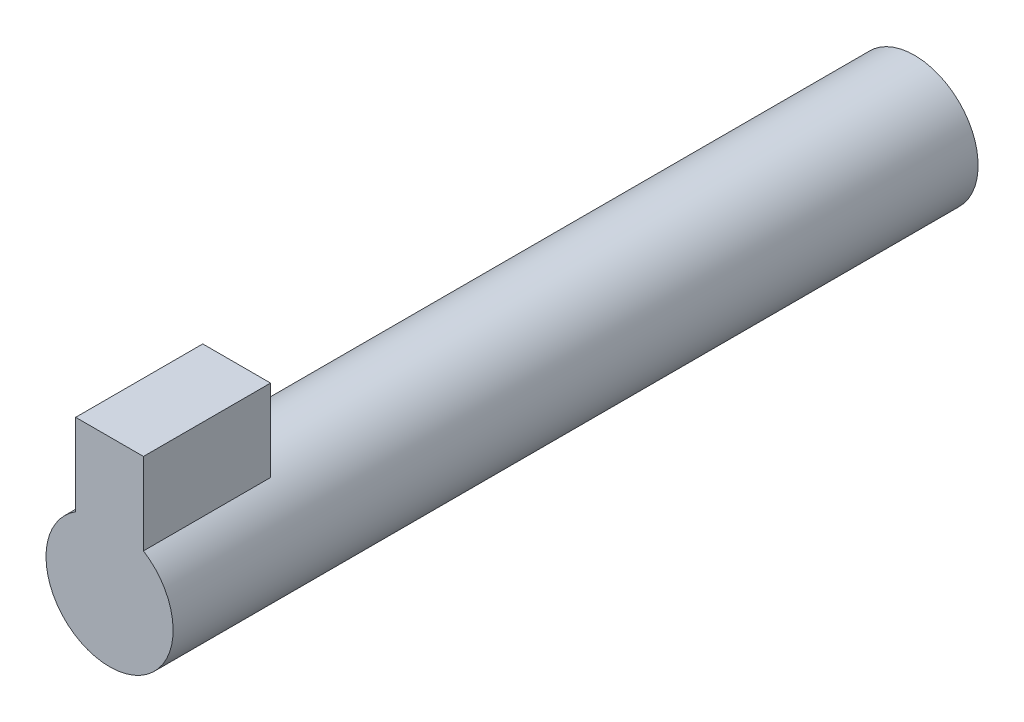
ISO-10303-21;
HEADER;
FILE_DESCRIPTION(('STEP AP214'),'2;1');
FILE_NAME('part.step','',(''),(''),'','','');
FILE_SCHEMA(('AUTOMOTIVE_DESIGN { 1 0 10303 214 1 1 1 1 }'));
ENDSEC;
DATA;
#1=APPLICATION_CONTEXT('core data for automotive mechanical design processes');
#2=APPLICATION_PROTOCOL_DEFINITION('international standard','automotive_design',2000,#1);
#3=PRODUCT_CONTEXT('',#1,'mechanical');
#4=PRODUCT('Part','Part','',(#3));
#5=PRODUCT_RELATED_PRODUCT_CATEGORY('part','',(#4));
#6=PRODUCT_DEFINITION_FORMATION('','',#4);
#7=PRODUCT_DEFINITION_CONTEXT('part definition',#1,'design');
#8=PRODUCT_DEFINITION('design','',#6,#7);
#9=PRODUCT_DEFINITION_SHAPE('','',#8);
#10=(LENGTH_UNIT() NAMED_UNIT(*) SI_UNIT(.MILLI.,.METRE.));
#11=(NAMED_UNIT(*) PLANE_ANGLE_UNIT() SI_UNIT($,.RADIAN.));
#12=(NAMED_UNIT(*) SI_UNIT($,.STERADIAN.) SOLID_ANGLE_UNIT());
#13=UNCERTAINTY_MEASURE_WITH_UNIT(LENGTH_MEASURE(1.E-05),#10,'distance_accuracy_value','');
#14=(GEOMETRIC_REPRESENTATION_CONTEXT(3) GLOBAL_UNCERTAINTY_ASSIGNED_CONTEXT((#13)) GLOBAL_UNIT_ASSIGNED_CONTEXT((#10,
#11,#12)) REPRESENTATION_CONTEXT('',''));
#15=CARTESIAN_POINT('',(0.,0.,0.));
#16=DIRECTION('',(0.,0.,1.));
#17=DIRECTION('',(1.,0.,0.));
#18=AXIS2_PLACEMENT_3D('',#15,#16,#17);
#19=CARTESIAN_POINT('',(0.,0.,0.));
#20=DIRECTION('',(0.,0.,1.));
#21=DIRECTION('',(1.,0.,0.));
#22=AXIS2_PLACEMENT_3D('',#19,#20,#21);
#23=PLANE('',#22);
#24=CARTESIAN_POINT('',(0.,0.,0.));
#25=DIRECTION('',(0.,0.,-1.));
#26=DIRECTION('',(-1.,0.,0.));
#27=AXIS2_PLACEMENT_3D('',#24,#25,#26);
#28=CIRCLE('',#27,4.7625);
#29=CARTESIAN_POINT('',(-2.54,4.02862336909272,0.));
#30=VERTEX_POINT('',#29);
#31=CARTESIAN_POINT('',(2.54,4.02862336909272,0.));
#32=VERTEX_POINT('',#31);
#33=EDGE_CURVE('E96',#30,#32,#28,.T.);
#34=ORIENTED_EDGE('',*,*,#33,.F.);
#35=DIRECTION('',(0.,1.,0.));
#36=VECTOR('',#35,1.);
#37=CARTESIAN_POINT('',(-2.54,0.,0.));
#38=LINE('',#37,#36);
#39=CARTESIAN_POINT('',(-2.54,10.16,0.));
#40=VERTEX_POINT('',#39);
#41=EDGE_CURVE('E98',#30,#40,#38,.T.);
#42=ORIENTED_EDGE('',*,*,#41,.T.);
#43=DIRECTION('',(1.,0.,0.));
#44=VECTOR('',#43,1.);
#45=CARTESIAN_POINT('',(0.,10.16,0.));
#46=LINE('',#45,#44);
#47=CARTESIAN_POINT('',(2.54,10.16,0.));
#48=VERTEX_POINT('',#47);
#49=EDGE_CURVE('E113',#40,#48,#46,.T.);
#50=ORIENTED_EDGE('',*,*,#49,.T.);
#51=DIRECTION('',(0.,1.,0.));
#52=VECTOR('',#51,1.);
#53=CARTESIAN_POINT('',(2.54,0.,0.));
#54=LINE('',#53,#52);
#55=EDGE_CURVE('E99',#32,#48,#54,.T.);
#56=ORIENTED_EDGE('',*,*,#55,.F.);
#57=EDGE_LOOP('',(#34,#42,#50,#56));
#58=FACE_BOUND('',#57,.T.);
#59=ADVANCED_FACE('F47',(#58),#23,.F.);
#60=CARTESIAN_POINT('',(0.,0.,9.525));
#61=DIRECTION('',(0.,0.,-1.));
#62=DIRECTION('',(-1.,0.,0.));
#63=AXIS2_PLACEMENT_3D('',#60,#61,#62);
#64=CYLINDRICAL_SURFACE('',#63,4.7625);
#65=DIRECTION('',(0.,0.,-1.));
#66=VECTOR('',#65,1.);
#67=CARTESIAN_POINT('',(-2.54,4.02862336909272,9.525));
#68=LINE('',#67,#66);
#69=CARTESIAN_POINT('',(-2.54,4.02862336909272,9.525));
#70=VERTEX_POINT('',#69);
#71=EDGE_CURVE('E65',#70,#30,#68,.T.);
#72=ORIENTED_EDGE('',*,*,#71,.T.);
#73=ORIENTED_EDGE('',*,*,#33,.T.);
#74=DIRECTION('',(0.,0.,-1.));
#75=VECTOR('',#74,1.);
#76=CARTESIAN_POINT('',(2.54,4.02862336909272,9.525));
#77=LINE('',#76,#75);
#78=CARTESIAN_POINT('',(2.54,4.02862336909272,9.525));
#79=VERTEX_POINT('',#78);
#80=EDGE_CURVE('E11',#79,#32,#77,.T.);
#81=ORIENTED_EDGE('',*,*,#80,.F.);
#82=CARTESIAN_POINT('',(0.,0.,9.525));
#83=DIRECTION('',(0.,0.,1.));
#84=DIRECTION('',(1.,0.,0.));
#85=AXIS2_PLACEMENT_3D('',#82,#83,#84);
#86=CIRCLE('',#85,4.7625);
#87=EDGE_CURVE('E106',#70,#79,#86,.T.);
#88=ORIENTED_EDGE('',*,*,#87,.F.);
#89=EDGE_LOOP('',(#72,#73,#81,#88));
#90=FACE_BOUND('',#89,.T.);
#91=CARTESIAN_POINT('',(0.,0.,-50.8));
#92=DIRECTION('',(0.,0.,-1.));
#93=DIRECTION('',(-1.,0.,0.));
#94=AXIS2_PLACEMENT_3D('',#91,#92,#93);
#95=CIRCLE('',#94,4.7625);
#96=CARTESIAN_POINT('',(-4.7625,0.,-50.8));
#97=VERTEX_POINT('',#96);
#98=EDGE_CURVE('E103',#97,#97,#95,.T.);
#99=ORIENTED_EDGE('',*,*,#98,.F.);
#100=EDGE_LOOP('',(#99));
#101=FACE_BOUND('',#100,.T.);
#102=ADVANCED_FACE('F49',(#90,#101),#64,.T.);
#103=CARTESIAN_POINT('',(2.54,0.,9.525));
#104=DIRECTION('',(-1.,0.,0.));
#105=DIRECTION('',(0.,-1.,0.));
#106=AXIS2_PLACEMENT_3D('',#103,#104,#105);
#107=PLANE('',#106);
#108=ORIENTED_EDGE('',*,*,#55,.T.);
#109=DIRECTION('',(0.,0.,-1.));
#110=VECTOR('',#109,1.);
#111=CARTESIAN_POINT('',(2.54,10.16,9.525));
#112=LINE('',#111,#110);
#113=CARTESIAN_POINT('',(2.54,10.16,9.525));
#114=VERTEX_POINT('',#113);
#115=EDGE_CURVE('E57',#114,#48,#112,.T.);
#116=ORIENTED_EDGE('',*,*,#115,.F.);
#117=DIRECTION('',(0.,1.,0.));
#118=VECTOR('',#117,1.);
#119=CARTESIAN_POINT('',(2.54,0.,9.525));
#120=LINE('',#119,#118);
#121=EDGE_CURVE('E89',#79,#114,#120,.T.);
#122=ORIENTED_EDGE('',*,*,#121,.F.);
#123=ORIENTED_EDGE('',*,*,#80,.T.);
#124=EDGE_LOOP('',(#108,#116,#122,#123));
#125=FACE_BOUND('',#124,.T.);
#126=ADVANCED_FACE('F140',(#125),#107,.F.);
#127=CARTESIAN_POINT('',(0.,10.16,9.525));
#128=DIRECTION('',(0.,1.,0.));
#129=DIRECTION('',(-1.,0.,0.));
#130=AXIS2_PLACEMENT_3D('',#127,#128,#129);
#131=PLANE('',#130);
#132=ORIENTED_EDGE('',*,*,#49,.F.);
#133=DIRECTION('',(0.,0.,-1.));
#134=VECTOR('',#133,1.);
#135=CARTESIAN_POINT('',(-2.54,10.16,9.525));
#136=LINE('',#135,#134);
#137=CARTESIAN_POINT('',(-2.54,10.16,9.525));
#138=VERTEX_POINT('',#137);
#139=EDGE_CURVE('E84',#138,#40,#136,.T.);
#140=ORIENTED_EDGE('',*,*,#139,.F.);
#141=DIRECTION('',(1.,0.,0.));
#142=VECTOR('',#141,1.);
#143=CARTESIAN_POINT('',(0.,10.16,9.525));
#144=LINE('',#143,#142);
#145=EDGE_CURVE('E125',#138,#114,#144,.T.);
#146=ORIENTED_EDGE('',*,*,#145,.T.);
#147=ORIENTED_EDGE('',*,*,#115,.T.);
#148=EDGE_LOOP('',(#132,#140,#146,#147));
#149=FACE_BOUND('',#148,.T.);
#150=ADVANCED_FACE('F145',(#149),#131,.T.);
#151=CARTESIAN_POINT('',(-2.54,0.,9.525));
#152=DIRECTION('',(-1.,0.,0.));
#153=DIRECTION('',(0.,0.,1.));
#154=AXIS2_PLACEMENT_3D('',#151,#152,#153);
#155=PLANE('',#154);
#156=ORIENTED_EDGE('',*,*,#41,.F.);
#157=ORIENTED_EDGE('',*,*,#71,.F.);
#158=DIRECTION('',(0.,1.,0.));
#159=VECTOR('',#158,1.);
#160=CARTESIAN_POINT('',(-2.54,0.,9.525));
#161=LINE('',#160,#159);
#162=EDGE_CURVE('E109',#70,#138,#161,.T.);
#163=ORIENTED_EDGE('',*,*,#162,.T.);
#164=ORIENTED_EDGE('',*,*,#139,.T.);
#165=EDGE_LOOP('',(#156,#157,#163,#164));
#166=FACE_BOUND('',#165,.T.);
#167=ADVANCED_FACE('F111',(#166),#155,.T.);
#168=CARTESIAN_POINT('',(0.,0.,9.525));
#169=DIRECTION('',(0.,0.,1.));
#170=DIRECTION('',(1.,0.,0.));
#171=AXIS2_PLACEMENT_3D('',#168,#169,#170);
#172=PLANE('',#171);
#173=ORIENTED_EDGE('',*,*,#87,.T.);
#174=ORIENTED_EDGE('',*,*,#121,.T.);
#175=ORIENTED_EDGE('',*,*,#145,.F.);
#176=ORIENTED_EDGE('',*,*,#162,.F.);
#177=EDGE_LOOP('',(#173,#174,#175,#176));
#178=FACE_BOUND('',#177,.T.);
#179=ADVANCED_FACE('F152',(#178),#172,.T.);
#180=CARTESIAN_POINT('',(0.,0.,-50.8));
#181=DIRECTION('',(0.,0.,-1.));
#182=DIRECTION('',(-1.,0.,0.));
#183=AXIS2_PLACEMENT_3D('',#180,#181,#182);
#184=PLANE('',#183);
#185=ORIENTED_EDGE('',*,*,#98,.T.);
#186=EDGE_LOOP('',(#185));
#187=FACE_BOUND('',#186,.T.);
#188=ADVANCED_FACE('F138',(#187),#184,.T.);
#189=CLOSED_SHELL('',(#59,#102,#126,#150,#167,#179,#188));
#190=MANIFOLD_SOLID_BREP('B2',#189);
#191=ADVANCED_BREP_SHAPE_REPRESENTATION('',(#18,#190),#14);
#192=SHAPE_DEFINITION_REPRESENTATION(#9,#191);
ENDSEC;
END-ISO-10303-21;
